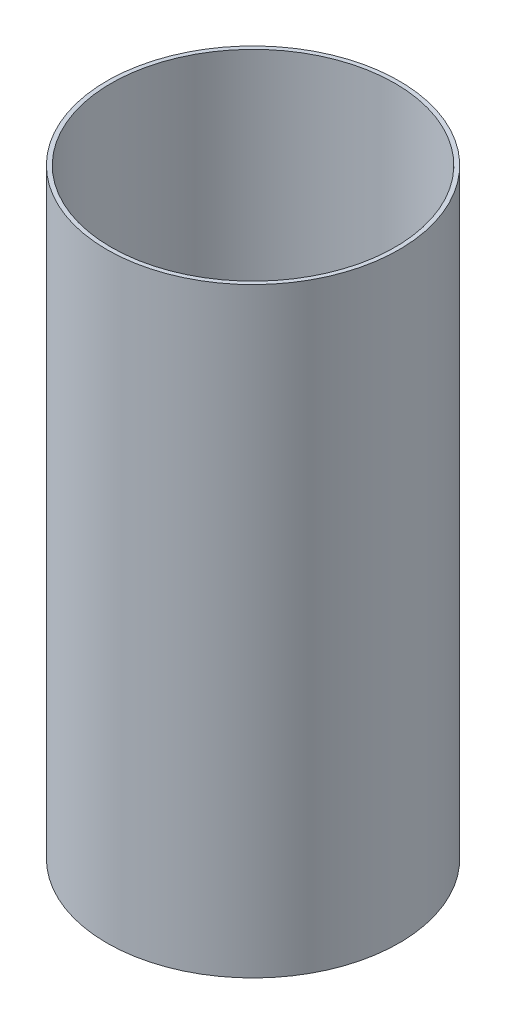
ISO-10303-21;
HEADER;
FILE_DESCRIPTION(('STEP AP214'),'2;1');
FILE_NAME('part.step','',(''),(''),'','','');
FILE_SCHEMA(('AUTOMOTIVE_DESIGN { 1 0 10303 214 1 1 1 1 }'));
ENDSEC;
DATA;
#1=APPLICATION_CONTEXT('core data for automotive mechanical design processes');
#2=APPLICATION_PROTOCOL_DEFINITION('international standard','automotive_design',2000,#1);
#3=PRODUCT_CONTEXT('',#1,'mechanical');
#4=PRODUCT('Part','Part','',(#3));
#5=PRODUCT_RELATED_PRODUCT_CATEGORY('part','',(#4));
#6=PRODUCT_DEFINITION_FORMATION('','',#4);
#7=PRODUCT_DEFINITION_CONTEXT('part definition',#1,'design');
#8=PRODUCT_DEFINITION('design','',#6,#7);
#9=PRODUCT_DEFINITION_SHAPE('','',#8);
#10=(LENGTH_UNIT() NAMED_UNIT(*) SI_UNIT(.MILLI.,.METRE.));
#11=(NAMED_UNIT(*) PLANE_ANGLE_UNIT() SI_UNIT($,.RADIAN.));
#12=(NAMED_UNIT(*) SI_UNIT($,.STERADIAN.) SOLID_ANGLE_UNIT());
#13=UNCERTAINTY_MEASURE_WITH_UNIT(LENGTH_MEASURE(1.E-05),#10,'distance_accuracy_value','');
#14=(GEOMETRIC_REPRESENTATION_CONTEXT(3) GLOBAL_UNCERTAINTY_ASSIGNED_CONTEXT((#13)) GLOBAL_UNIT_ASSIGNED_CONTEXT((#10,
#11,#12)) REPRESENTATION_CONTEXT('',''));
#15=CARTESIAN_POINT('',(0.,0.,0.));
#16=DIRECTION('',(0.,0.,1.));
#17=DIRECTION('',(1.,0.,0.));
#18=AXIS2_PLACEMENT_3D('',#15,#16,#17);
#19=CARTESIAN_POINT('',(0.,101.6,0.));
#20=DIRECTION('',(0.,1.,0.));
#21=DIRECTION('',(0.,0.,1.));
#22=AXIS2_PLACEMENT_3D('',#19,#20,#21);
#23=PLANE('',#22);
#24=CARTESIAN_POINT('',(0.,101.6,0.));
#25=DIRECTION('',(0.,1.,0.));
#26=DIRECTION('',(0.,0.,1.));
#27=AXIS2_PLACEMENT_3D('',#24,#25,#26);
#28=CIRCLE('',#27,49.4538);
#29=CARTESIAN_POINT('',(0.,101.6,49.4538));
#30=VERTEX_POINT('',#29);
#31=EDGE_CURVE('E10',#30,#30,#28,.T.);
#32=ORIENTED_EDGE('',*,*,#31,.T.);
#33=EDGE_LOOP('',(#32));
#34=FACE_BOUND('',#33,.T.);
#35=CARTESIAN_POINT('',(0.,101.6,0.));
#36=DIRECTION('',(0.,1.,0.));
#37=DIRECTION('',(0.,0.,1.));
#38=AXIS2_PLACEMENT_3D('',#35,#36,#37);
#39=CIRCLE('',#38,48.0441);
#40=CARTESIAN_POINT('',(0.,101.6,48.0441));
#41=VERTEX_POINT('',#40);
#42=EDGE_CURVE('E44',#41,#41,#39,.T.);
#43=ORIENTED_EDGE('',*,*,#42,.F.);
#44=EDGE_LOOP('',(#43));
#45=FACE_BOUND('',#44,.T.);
#46=ADVANCED_FACE('F33',(#34,#45),#23,.T.);
#47=CARTESIAN_POINT('',(0.,-101.6,0.));
#48=DIRECTION('',(0.,1.,0.));
#49=DIRECTION('',(0.,0.,1.));
#50=AXIS2_PLACEMENT_3D('',#47,#48,#49);
#51=PLANE('',#50);
#52=CARTESIAN_POINT('',(0.,-101.6,0.));
#53=DIRECTION('',(0.,1.,0.));
#54=DIRECTION('',(0.,0.,1.));
#55=AXIS2_PLACEMENT_3D('',#52,#53,#54);
#56=CIRCLE('',#55,49.4538);
#57=CARTESIAN_POINT('',(0.,-101.6,49.4538));
#58=VERTEX_POINT('',#57);
#59=EDGE_CURVE('E37',#58,#58,#56,.T.);
#60=ORIENTED_EDGE('',*,*,#59,.F.);
#61=EDGE_LOOP('',(#60));
#62=FACE_BOUND('',#61,.T.);
#63=CARTESIAN_POINT('',(0.,-101.6,0.));
#64=DIRECTION('',(0.,1.,0.));
#65=DIRECTION('',(0.,0.,1.));
#66=AXIS2_PLACEMENT_3D('',#63,#64,#65);
#67=CIRCLE('',#66,48.0441);
#68=CARTESIAN_POINT('',(0.,-101.6,48.0441));
#69=VERTEX_POINT('',#68);
#70=EDGE_CURVE('E46',#69,#69,#67,.T.);
#71=ORIENTED_EDGE('',*,*,#70,.T.);
#72=EDGE_LOOP('',(#71));
#73=FACE_BOUND('',#72,.T.);
#74=ADVANCED_FACE('F56',(#62,#73),#51,.F.);
#75=CARTESIAN_POINT('',(0.,101.6,0.));
#76=DIRECTION('',(0.,-1.,0.));
#77=DIRECTION('',(0.,0.,-1.));
#78=AXIS2_PLACEMENT_3D('',#75,#76,#77);
#79=CYLINDRICAL_SURFACE('',#78,49.4538);
#80=ORIENTED_EDGE('',*,*,#31,.F.);
#81=EDGE_LOOP('',(#80));
#82=FACE_BOUND('',#81,.T.);
#83=ORIENTED_EDGE('',*,*,#59,.T.);
#84=EDGE_LOOP('',(#83));
#85=FACE_BOUND('',#84,.T.);
#86=ADVANCED_FACE('F35',(#82,#85),#79,.T.);
#87=CARTESIAN_POINT('',(0.,101.6,0.));
#88=DIRECTION('',(0.,-1.,0.));
#89=DIRECTION('',(0.,0.,-1.));
#90=AXIS2_PLACEMENT_3D('',#87,#88,#89);
#91=CYLINDRICAL_SURFACE('',#90,48.0441);
#92=ORIENTED_EDGE('',*,*,#42,.T.);
#93=EDGE_LOOP('',(#92));
#94=FACE_BOUND('',#93,.T.);
#95=ORIENTED_EDGE('',*,*,#70,.F.);
#96=EDGE_LOOP('',(#95));
#97=FACE_BOUND('',#96,.T.);
#98=ADVANCED_FACE('F52',(#94,#97),#91,.F.);
#99=CLOSED_SHELL('',(#46,#74,#86,#98));
#100=MANIFOLD_SOLID_BREP('B2',#99);
#101=ADVANCED_BREP_SHAPE_REPRESENTATION('',(#18,#100),#14);
#102=SHAPE_DEFINITION_REPRESENTATION(#9,#101);
ENDSEC;
END-ISO-10303-21;
